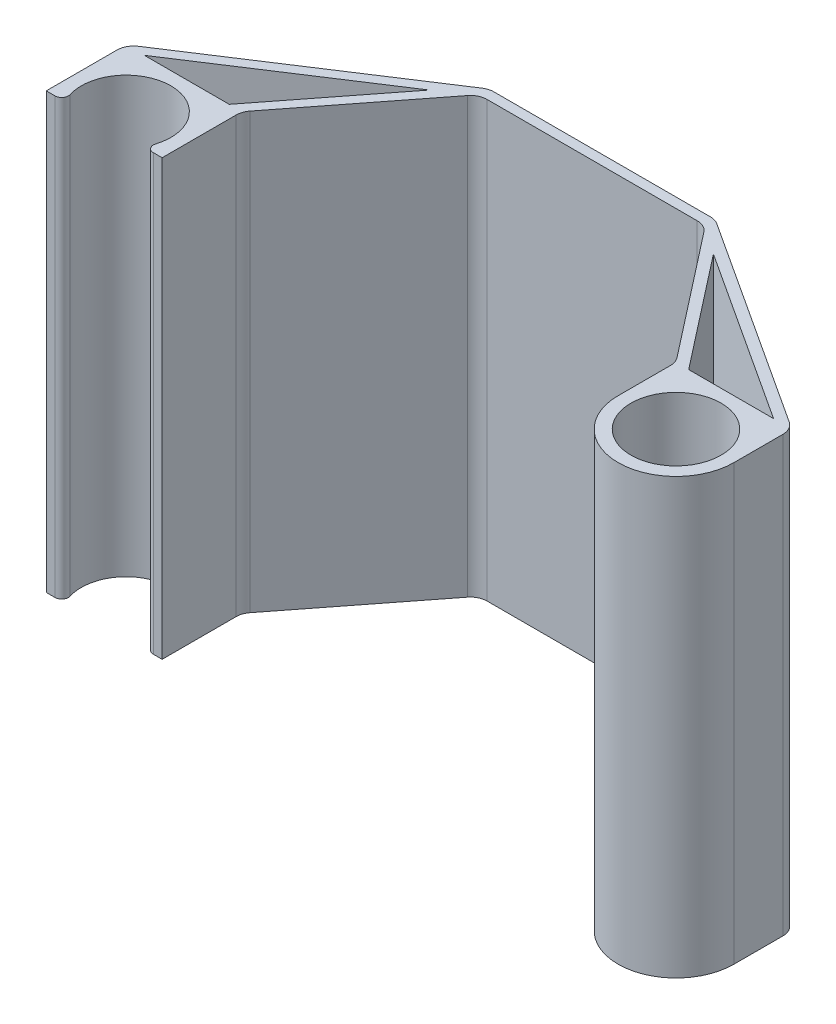
ISO-10303-21;
HEADER;
FILE_DESCRIPTION(('STEP AP214'),'2;1');
FILE_NAME('part.step','',(''),(''),'','','');
FILE_SCHEMA(('AUTOMOTIVE_DESIGN { 1 0 10303 214 1 1 1 1 }'));
ENDSEC;
DATA;
#1=APPLICATION_CONTEXT('core data for automotive mechanical design processes');
#2=APPLICATION_PROTOCOL_DEFINITION('international standard','automotive_design',2000,#1);
#3=PRODUCT_CONTEXT('',#1,'mechanical');
#4=PRODUCT('Part','Part','',(#3));
#5=PRODUCT_RELATED_PRODUCT_CATEGORY('part','',(#4));
#6=PRODUCT_DEFINITION_FORMATION('','',#4);
#7=PRODUCT_DEFINITION_CONTEXT('part definition',#1,'design');
#8=PRODUCT_DEFINITION('design','',#6,#7);
#9=PRODUCT_DEFINITION_SHAPE('','',#8);
#10=(LENGTH_UNIT() NAMED_UNIT(*) SI_UNIT(.MILLI.,.METRE.));
#11=(NAMED_UNIT(*) PLANE_ANGLE_UNIT() SI_UNIT($,.RADIAN.));
#12=(NAMED_UNIT(*) SI_UNIT($,.STERADIAN.) SOLID_ANGLE_UNIT());
#13=UNCERTAINTY_MEASURE_WITH_UNIT(LENGTH_MEASURE(1.E-05),#10,'distance_accuracy_value','');
#14=(GEOMETRIC_REPRESENTATION_CONTEXT(3) GLOBAL_UNCERTAINTY_ASSIGNED_CONTEXT((#13)) GLOBAL_UNIT_ASSIGNED_CONTEXT((#10,
#11,#12)) REPRESENTATION_CONTEXT('',''));
#15=CARTESIAN_POINT('',(0.,0.,0.));
#16=DIRECTION('',(0.,0.,1.));
#17=DIRECTION('',(1.,0.,0.));
#18=AXIS2_PLACEMENT_3D('',#15,#16,#17);
#19=CARTESIAN_POINT('',(65.2,130.5,66.97));
#20=DIRECTION('',(-1.,0.,0.));
#21=DIRECTION('',(0.,0.,1.));
#22=AXIS2_PLACEMENT_3D('',#19,#20,#21);
#23=PLANE('',#22);
#24=DIRECTION('',(0.,0.,-1.));
#25=VECTOR('',#24,1.);
#26=CARTESIAN_POINT('',(65.2,0.,66.97));
#27=LINE('',#26,#25);
#28=CARTESIAN_POINT('',(65.2,0.,60.4));
#29=VERTEX_POINT('',#28);
#30=CARTESIAN_POINT('',(65.2,0.,44.7194045448655));
#31=VERTEX_POINT('',#30);
#32=EDGE_CURVE('E266',#29,#31,#27,.T.);
#33=ORIENTED_EDGE('',*,*,#32,.F.);
#34=DIRECTION('',(0.,-1.,0.));
#35=VECTOR('',#34,1.);
#36=CARTESIAN_POINT('',(65.2,130.5,60.4));
#37=LINE('',#36,#35);
#38=CARTESIAN_POINT('',(65.2,130.5,60.4));
#39=VERTEX_POINT('',#38);
#40=EDGE_CURVE('E240',#39,#29,#37,.T.);
#41=ORIENTED_EDGE('',*,*,#40,.F.);
#42=DIRECTION('',(0.,0.,-1.));
#43=VECTOR('',#42,1.);
#44=CARTESIAN_POINT('',(65.2,130.5,66.97));
#45=LINE('',#44,#43);
#46=CARTESIAN_POINT('',(65.2,130.5,44.7194045448655));
#47=VERTEX_POINT('',#46);
#48=EDGE_CURVE('E249',#39,#47,#45,.T.);
#49=ORIENTED_EDGE('',*,*,#48,.T.);
#50=DIRECTION('',(0.,-1.,0.));
#51=VECTOR('',#50,1.);
#52=CARTESIAN_POINT('',(65.2,0.,44.7194045448655));
#53=LINE('',#52,#51);
#54=EDGE_CURVE('E402',#47,#31,#53,.T.);
#55=ORIENTED_EDGE('',*,*,#54,.T.);
#56=EDGE_LOOP('',(#33,#41,#49,#55));
#57=FACE_BOUND('',#56,.T.);
#58=ADVANCED_FACE('F36',(#57),#23,.T.);
#59=CARTESIAN_POINT('',(-97.3586449242469,130.5,64.97));
#60=DIRECTION('',(0.,-1.,0.));
#61=DIRECTION('',(0.,0.,-1.));
#62=AXIS2_PLACEMENT_3D('',#59,#60,#61);
#63=PLANE('',#62);
#64=CARTESIAN_POINT('',(82.6,130.5,60.4));
#65=DIRECTION('',(0.,-1.,0.));
#66=DIRECTION('',(0.,0.,-1.));
#67=AXIS2_PLACEMENT_3D('',#64,#65,#66);
#68=CIRCLE('',#67,13.55);
#69=CARTESIAN_POINT('',(82.6,130.5,46.85));
#70=VERTEX_POINT('',#69);
#71=EDGE_CURVE('E492',#70,#70,#68,.T.);
#72=ORIENTED_EDGE('',*,*,#71,.T.);
#73=EDGE_LOOP('',(#72));
#74=FACE_BOUND('',#73,.T.);
#75=DIRECTION('',(-1.,0.,0.));
#76=VECTOR('',#75,1.);
#77=CARTESIAN_POINT('',(69.004681326997,130.5,43.));
#78=LINE('',#77,#76);
#79=CARTESIAN_POINT('',(94.5042914623327,130.5,43.));
#80=VERTEX_POINT('',#79);
#81=CARTESIAN_POINT('',(69.004681326997,130.5,43.));
#82=VERTEX_POINT('',#81);
#83=EDGE_CURVE('E486',#80,#82,#78,.T.);
#84=ORIENTED_EDGE('',*,*,#83,.T.);
#85=DIRECTION('',(-0.615031798693877,0.,-0.788502306017791));
#86=VECTOR('',#85,1.);
#87=CARTESIAN_POINT('',(69.004681326997,130.5,43.));
#88=LINE('',#87,#86);
#89=CARTESIAN_POINT('',(42.6566553276392,130.5,9.22047948800275));
#90=VERTEX_POINT('',#89);
#91=EDGE_CURVE('E478',#82,#90,#88,.T.);
#92=ORIENTED_EDGE('',*,*,#91,.T.);
#93=DIRECTION('',(0.837863058280952,0.,0.545880477364863));
#94=VECTOR('',#93,1.);
#95=CARTESIAN_POINT('',(94.5042914623327,130.5,43.));
#96=LINE('',#95,#94);
#97=EDGE_CURVE('E474',#90,#80,#96,.T.);
#98=ORIENTED_EDGE('',*,*,#97,.T.);
#99=EDGE_LOOP('',(#84,#92,#98));
#100=FACE_BOUND('',#99,.T.);
#101=DIRECTION('',(0.615031798693877,0.,-0.788502306017791));
#102=VECTOR('',#101,1.);
#103=CARTESIAN_POINT('',(-69.004681326997,130.5,43.));
#104=LINE('',#103,#102);
#105=CARTESIAN_POINT('',(-69.004681326997,130.5,43.));
#106=VERTEX_POINT('',#105);
#107=CARTESIAN_POINT('',(-42.6566553276392,130.5,9.22047948800275));
#108=VERTEX_POINT('',#107);
#109=EDGE_CURVE('E274',#106,#108,#104,.T.);
#110=ORIENTED_EDGE('',*,*,#109,.F.);
#111=DIRECTION('',(1.,0.,0.));
#112=VECTOR('',#111,1.);
#113=CARTESIAN_POINT('',(-69.004681326997,130.5,43.));
#114=LINE('',#113,#112);
#115=CARTESIAN_POINT('',(-94.5042914623327,130.5,43.));
#116=VERTEX_POINT('',#115);
#117=EDGE_CURVE('E280',#116,#106,#114,.T.);
#118=ORIENTED_EDGE('',*,*,#117,.F.);
#119=DIRECTION('',(-0.837863058280952,0.,0.545880477364863));
#120=VECTOR('',#119,1.);
#121=CARTESIAN_POINT('',(-94.5042914623327,130.5,43.));
#122=LINE('',#121,#120);
#123=EDGE_CURVE('E276',#108,#116,#122,.T.);
#124=ORIENTED_EDGE('',*,*,#123,.F.);
#125=EDGE_LOOP('',(#110,#118,#124));
#126=FACE_BOUND('',#125,.T.);
#127=ORIENTED_EDGE('',*,*,#48,.F.);
#128=CARTESIAN_POINT('',(82.6,130.5,60.4));
#129=DIRECTION('',(0.,1.,0.));
#130=DIRECTION('',(0.,0.,-1.));
#131=AXIS2_PLACEMENT_3D('',#128,#129,#130);
#132=CIRCLE('',#131,17.4);
#133=CARTESIAN_POINT('',(100.,130.5,60.4));
#134=VERTEX_POINT('',#133);
#135=EDGE_CURVE('E234',#39,#134,#132,.T.);
#136=ORIENTED_EDGE('',*,*,#135,.T.);
#137=DIRECTION('',(0.,0.,1.));
#138=VECTOR('',#137,1.);
#139=CARTESIAN_POINT('',(100.,130.5,43.));
#140=LINE('',#139,#138);
#141=CARTESIAN_POINT('',(100.,130.5,45.7099865434267));
#142=VERTEX_POINT('',#141);
#143=EDGE_CURVE('E246',#142,#134,#140,.T.);
#144=ORIENTED_EDGE('',*,*,#143,.F.);
#145=CARTESIAN_POINT('',(95.,130.5,45.7099865434267));
#146=DIRECTION('',(0.,-1.,0.));
#147=DIRECTION('',(0.,0.,-1.));
#148=AXIS2_PLACEMENT_3D('',#145,#146,#147);
#149=CIRCLE('',#148,5.);
#150=CARTESIAN_POINT('',(97.7294023868243,130.5,41.5206712520219));
#151=VERTEX_POINT('',#150);
#152=EDGE_CURVE('E383',#142,#151,#149,.F.);
#153=ORIENTED_EDGE('',*,*,#152,.T.);
#154=DIRECTION('',(0.837863058280952,0.,0.545880477364863));
#155=VECTOR('',#154,1.);
#156=CARTESIAN_POINT('',(34.,130.5,0.));
#157=LINE('',#156,#155);
#158=CARTESIAN_POINT('',(35.2443067620299,130.5,0.810684708595236));
#159=VERTEX_POINT('',#158);
#160=EDGE_CURVE('E254',#159,#151,#157,.T.);
#161=ORIENTED_EDGE('',*,*,#160,.F.);
#162=CARTESIAN_POINT('',(32.5149043752056,130.5,5.));
#163=DIRECTION('',(0.,-1.,0.));
#164=DIRECTION('',(0.,0.,-1.));
#165=AXIS2_PLACEMENT_3D('',#162,#163,#164);
#166=CIRCLE('',#165,5.);
#167=CARTESIAN_POINT('',(32.5149043752056,130.5,0.));
#168=VERTEX_POINT('',#167);
#169=EDGE_CURVE('E385',#159,#168,#166,.F.);
#170=ORIENTED_EDGE('',*,*,#169,.T.);
#171=DIRECTION('',(-1.,0.,0.));
#172=VECTOR('',#171,1.);
#173=CARTESIAN_POINT('',(0.,130.5,0.));
#174=LINE('',#173,#172);
#175=CARTESIAN_POINT('',(-32.5149043752056,130.5,0.));
#176=VERTEX_POINT('',#175);
#177=EDGE_CURVE('E298',#168,#176,#174,.T.);
#178=ORIENTED_EDGE('',*,*,#177,.T.);
#179=CARTESIAN_POINT('',(-32.5149043752056,130.5,5.));
#180=DIRECTION('',(0.,-1.,0.));
#181=DIRECTION('',(0.,0.,-1.));
#182=AXIS2_PLACEMENT_3D('',#179,#180,#181);
#183=CIRCLE('',#182,5.);
#184=CARTESIAN_POINT('',(-35.2443067620299,130.5,0.810684708595245));
#185=VERTEX_POINT('',#184);
#186=EDGE_CURVE('E387',#176,#185,#183,.F.);
#187=ORIENTED_EDGE('',*,*,#186,.T.);
#188=DIRECTION('',(-0.837863058280952,0.,0.545880477364863));
#189=VECTOR('',#188,1.);
#190=CARTESIAN_POINT('',(-34.,130.5,0.));
#191=LINE('',#190,#189);
#192=CARTESIAN_POINT('',(-97.7294023868243,130.5,41.5206712520219));
#193=VERTEX_POINT('',#192);
#194=EDGE_CURVE('E301',#185,#193,#191,.T.);
#195=ORIENTED_EDGE('',*,*,#194,.T.);
#196=CARTESIAN_POINT('',(-95.,130.5,45.7099865434267));
#197=DIRECTION('',(0.,-1.,0.));
#198=DIRECTION('',(0.,0.,-1.));
#199=AXIS2_PLACEMENT_3D('',#196,#197,#198);
#200=CIRCLE('',#199,5.);
#201=CARTESIAN_POINT('',(-100.,130.5,45.7099865434267));
#202=VERTEX_POINT('',#201);
#203=EDGE_CURVE('E389',#193,#202,#200,.F.);
#204=ORIENTED_EDGE('',*,*,#203,.T.);
#205=DIRECTION('',(0.,0.,1.));
#206=VECTOR('',#205,1.);
#207=CARTESIAN_POINT('',(-100.,130.5,43.));
#208=LINE('',#207,#206);
#209=CARTESIAN_POINT('',(-100.,130.5,66.97));
#210=VERTEX_POINT('',#209);
#211=EDGE_CURVE('E305',#202,#210,#208,.T.);
#212=ORIENTED_EDGE('',*,*,#211,.T.);
#213=DIRECTION('',(1.,0.,0.));
#214=VECTOR('',#213,1.);
#215=CARTESIAN_POINT('',(-100.,130.5,66.97));
#216=LINE('',#215,#214);
#217=CARTESIAN_POINT('',(-97.3586449242469,130.5,66.97));
#218=VERTEX_POINT('',#217);
#219=EDGE_CURVE('E307',#210,#218,#216,.T.);
#220=ORIENTED_EDGE('',*,*,#219,.T.);
#221=CARTESIAN_POINT('',(-97.3586449242469,130.5,64.97));
#222=DIRECTION('',(0.,1.,0.));
#223=DIRECTION('',(0.,0.,-1.));
#224=AXIS2_PLACEMENT_3D('',#221,#222,#223);
#225=CIRCLE('',#224,1.99999999999999);
#226=CARTESIAN_POINT('',(-95.4481407269334,130.5,64.3784142394822));
#227=VERTEX_POINT('',#226);
#228=EDGE_CURVE('E309',#218,#227,#225,.T.);
#229=ORIENTED_EDGE('',*,*,#228,.T.);
#230=CARTESIAN_POINT('',(-82.6,130.5,60.4));
#231=DIRECTION('',(0.,-1.,0.));
#232=DIRECTION('',(0.,0.,-1.));
#233=AXIS2_PLACEMENT_3D('',#230,#231,#232);
#234=CIRCLE('',#233,13.45);
#235=CARTESIAN_POINT('',(-69.7518592730666,130.5,64.3784142394822));
#236=VERTEX_POINT('',#235);
#237=EDGE_CURVE('E311',#227,#236,#234,.T.);
#238=ORIENTED_EDGE('',*,*,#237,.T.);
#239=CARTESIAN_POINT('',(-67.8413550757531,130.5,64.97));
#240=DIRECTION('',(0.,1.,0.));
#241=DIRECTION('',(0.,0.,-1.));
#242=AXIS2_PLACEMENT_3D('',#239,#240,#241);
#243=CIRCLE('',#242,1.99999999999999);
#244=CARTESIAN_POINT('',(-67.8413550757531,130.5,66.97));
#245=VERTEX_POINT('',#244);
#246=EDGE_CURVE('E313',#236,#245,#243,.T.);
#247=ORIENTED_EDGE('',*,*,#246,.T.);
#248=DIRECTION('',(1.,0.,0.));
#249=VECTOR('',#248,1.);
#250=CARTESIAN_POINT('',(-67.8413550757531,130.5,66.97));
#251=LINE('',#250,#249);
#252=CARTESIAN_POINT('',(-65.2,130.5,66.97));
#253=VERTEX_POINT('',#252);
#254=EDGE_CURVE('E315',#245,#253,#251,.T.);
#255=ORIENTED_EDGE('',*,*,#254,.T.);
#256=DIRECTION('',(0.,0.,-1.));
#257=VECTOR('',#256,1.);
#258=CARTESIAN_POINT('',(-65.2,130.5,66.97));
#259=LINE('',#258,#257);
#260=CARTESIAN_POINT('',(-65.2,130.5,44.7194045448655));
#261=VERTEX_POINT('',#260);
#262=EDGE_CURVE('E317',#253,#261,#259,.T.);
#263=ORIENTED_EDGE('',*,*,#262,.T.);
#264=CARTESIAN_POINT('',(-60.2,130.5,44.7194045448655));
#265=DIRECTION('',(0.,-1.,0.));
#266=DIRECTION('',(0.,0.,-1.));
#267=AXIS2_PLACEMENT_3D('',#264,#265,#266);
#268=CIRCLE('',#267,5.);
#269=CARTESIAN_POINT('',(-64.142511530089,130.5,41.6442455513961));
#270=VERTEX_POINT('',#269);
#271=EDGE_CURVE('E11',#261,#270,#268,.T.);
#272=ORIENTED_EDGE('',*,*,#271,.T.);
#273=DIRECTION('',(0.615031798693877,0.,-0.788502306017791));
#274=VECTOR('',#273,1.);
#275=CARTESIAN_POINT('',(-34.,130.5,3.));
#276=LINE('',#275,#274);
#277=CARTESIAN_POINT('',(-35.5013759850939,130.5,4.92484100653062));
#278=VERTEX_POINT('',#277);
#279=EDGE_CURVE('E320',#270,#278,#276,.T.);
#280=ORIENTED_EDGE('',*,*,#279,.T.);
#281=CARTESIAN_POINT('',(-31.5588644550049,130.5,8.));
#282=DIRECTION('',(0.,-1.,0.));
#283=DIRECTION('',(0.,0.,-1.));
#284=AXIS2_PLACEMENT_3D('',#281,#282,#283);
#285=CIRCLE('',#284,5.);
#286=CARTESIAN_POINT('',(-31.5588644550049,130.5,3.));
#287=VERTEX_POINT('',#286);
#288=EDGE_CURVE('E431',#278,#287,#285,.T.);
#289=ORIENTED_EDGE('',*,*,#288,.T.);
#290=DIRECTION('',(1.,0.,0.));
#291=VECTOR('',#290,1.);
#292=CARTESIAN_POINT('',(-34.,130.5,3.));
#293=LINE('',#292,#291);
#294=CARTESIAN_POINT('',(31.5588644550049,130.5,3.));
#295=VERTEX_POINT('',#294);
#296=EDGE_CURVE('E323',#287,#295,#293,.T.);
#297=ORIENTED_EDGE('',*,*,#296,.T.);
#298=CARTESIAN_POINT('',(31.5588644550049,130.5,8.));
#299=DIRECTION('',(0.,-1.,0.));
#300=DIRECTION('',(0.,0.,-1.));
#301=AXIS2_PLACEMENT_3D('',#298,#299,#300);
#302=CIRCLE('',#301,5.);
#303=CARTESIAN_POINT('',(35.5013759850939,130.5,4.92484100653062));
#304=VERTEX_POINT('',#303);
#305=EDGE_CURVE('E427',#295,#304,#302,.T.);
#306=ORIENTED_EDGE('',*,*,#305,.T.);
#307=DIRECTION('',(-0.615031798693877,0.,-0.788502306017791));
#308=VECTOR('',#307,1.);
#309=CARTESIAN_POINT('',(34.,130.5,3.));
#310=LINE('',#309,#308);
#311=CARTESIAN_POINT('',(64.142511530089,130.5,41.6442455513961));
#312=VERTEX_POINT('',#311);
#313=EDGE_CURVE('E259',#312,#304,#310,.T.);
#314=ORIENTED_EDGE('',*,*,#313,.F.);
#315=CARTESIAN_POINT('',(60.2,130.5,44.7194045448655));
#316=DIRECTION('',(0.,-1.,0.));
#317=DIRECTION('',(0.,0.,-1.));
#318=AXIS2_PLACEMENT_3D('',#315,#316,#317);
#319=CIRCLE('',#318,5.);
#320=EDGE_CURVE('E423',#312,#47,#319,.T.);
#321=ORIENTED_EDGE('',*,*,#320,.T.);
#322=EDGE_LOOP('',(#127,#136,#144,#153,#161,#170,#178,#187,#195,#204,#212,#220,#229,#238,#247,
#255,#263,#272,#280,#289,#297,#306,#314,#321));
#323=FACE_BOUND('',#322,.T.);
#324=ADVANCED_FACE('F245',(#74,#100,#126,#323),#63,.F.);
#325=CARTESIAN_POINT('',(-97.3586449242469,0.,64.97));
#326=DIRECTION('',(0.,-1.,0.));
#327=DIRECTION('',(0.,0.,-1.));
#328=AXIS2_PLACEMENT_3D('',#325,#326,#327);
#329=PLANE('',#328);
#330=CARTESIAN_POINT('',(82.6,0.,60.4));
#331=DIRECTION('',(0.,-1.,0.));
#332=DIRECTION('',(0.,0.,-1.));
#333=AXIS2_PLACEMENT_3D('',#330,#331,#332);
#334=CIRCLE('',#333,13.55);
#335=CARTESIAN_POINT('',(82.6,0.,46.85));
#336=VERTEX_POINT('',#335);
#337=EDGE_CURVE('E494',#336,#336,#334,.T.);
#338=ORIENTED_EDGE('',*,*,#337,.F.);
#339=EDGE_LOOP('',(#338));
#340=FACE_BOUND('',#339,.T.);
#341=CARTESIAN_POINT('',(82.6,0.,60.4));
#342=DIRECTION('',(0.,1.,0.));
#343=DIRECTION('',(0.,0.,-1.));
#344=AXIS2_PLACEMENT_3D('',#341,#342,#343);
#345=CIRCLE('',#344,17.4);
#346=CARTESIAN_POINT('',(100.,0.,60.4));
#347=VERTEX_POINT('',#346);
#348=EDGE_CURVE('E51',#29,#347,#345,.T.);
#349=ORIENTED_EDGE('',*,*,#348,.F.);
#350=ORIENTED_EDGE('',*,*,#32,.T.);
#351=CARTESIAN_POINT('',(60.2,0.,44.7194045448655));
#352=DIRECTION('',(0.,-1.,0.));
#353=DIRECTION('',(0.,0.,-1.));
#354=AXIS2_PLACEMENT_3D('',#351,#352,#353);
#355=CIRCLE('',#354,5.);
#356=CARTESIAN_POINT('',(64.142511530089,0.,41.6442455513961));
#357=VERTEX_POINT('',#356);
#358=EDGE_CURVE('E421',#31,#357,#355,.F.);
#359=ORIENTED_EDGE('',*,*,#358,.T.);
#360=DIRECTION('',(-0.615031798693877,0.,-0.788502306017791));
#361=VECTOR('',#360,1.);
#362=CARTESIAN_POINT('',(34.,0.,3.));
#363=LINE('',#362,#361);
#364=CARTESIAN_POINT('',(35.5013759850939,0.,4.92484100653062));
#365=VERTEX_POINT('',#364);
#366=EDGE_CURVE('E263',#357,#365,#363,.T.);
#367=ORIENTED_EDGE('',*,*,#366,.T.);
#368=CARTESIAN_POINT('',(31.5588644550049,0.,8.));
#369=DIRECTION('',(0.,-1.,0.));
#370=DIRECTION('',(0.,0.,-1.));
#371=AXIS2_PLACEMENT_3D('',#368,#369,#370);
#372=CIRCLE('',#371,5.);
#373=CARTESIAN_POINT('',(31.5588644550049,0.,3.));
#374=VERTEX_POINT('',#373);
#375=EDGE_CURVE('E425',#365,#374,#372,.F.);
#376=ORIENTED_EDGE('',*,*,#375,.T.);
#377=DIRECTION('',(1.,0.,0.));
#378=VECTOR('',#377,1.);
#379=CARTESIAN_POINT('',(-34.,0.,3.));
#380=LINE('',#379,#378);
#381=CARTESIAN_POINT('',(-31.5588644550049,0.,3.));
#382=VERTEX_POINT('',#381);
#383=EDGE_CURVE('E302',#382,#374,#380,.T.);
#384=ORIENTED_EDGE('',*,*,#383,.F.);
#385=CARTESIAN_POINT('',(-31.5588644550049,0.,8.));
#386=DIRECTION('',(0.,-1.,0.));
#387=DIRECTION('',(0.,0.,-1.));
#388=AXIS2_PLACEMENT_3D('',#385,#386,#387);
#389=CIRCLE('',#388,5.);
#390=CARTESIAN_POINT('',(-35.5013759850939,0.,4.92484100653062));
#391=VERTEX_POINT('',#390);
#392=EDGE_CURVE('E429',#382,#391,#389,.F.);
#393=ORIENTED_EDGE('',*,*,#392,.T.);
#394=DIRECTION('',(0.615031798693877,0.,-0.788502306017791));
#395=VECTOR('',#394,1.);
#396=CARTESIAN_POINT('',(-34.,0.,3.));
#397=LINE('',#396,#395);
#398=CARTESIAN_POINT('',(-64.142511530089,0.,41.6442455513961));
#399=VERTEX_POINT('',#398);
#400=EDGE_CURVE('E346',#399,#391,#397,.T.);
#401=ORIENTED_EDGE('',*,*,#400,.F.);
#402=CARTESIAN_POINT('',(-60.2,0.,44.7194045448655));
#403=DIRECTION('',(0.,-1.,0.));
#404=DIRECTION('',(0.,0.,-1.));
#405=AXIS2_PLACEMENT_3D('',#402,#403,#404);
#406=CIRCLE('',#405,5.);
#407=CARTESIAN_POINT('',(-65.2,0.,44.7194045448655));
#408=VERTEX_POINT('',#407);
#409=EDGE_CURVE('E44',#399,#408,#406,.F.);
#410=ORIENTED_EDGE('',*,*,#409,.T.);
#411=DIRECTION('',(0.,0.,-1.));
#412=VECTOR('',#411,1.);
#413=CARTESIAN_POINT('',(-65.2,0.,66.97));
#414=LINE('',#413,#412);
#415=CARTESIAN_POINT('',(-65.2,0.,66.97));
#416=VERTEX_POINT('',#415);
#417=EDGE_CURVE('E343',#416,#408,#414,.T.);
#418=ORIENTED_EDGE('',*,*,#417,.F.);
#419=DIRECTION('',(1.,0.,0.));
#420=VECTOR('',#419,1.);
#421=CARTESIAN_POINT('',(-67.8413550757531,0.,66.97));
#422=LINE('',#421,#420);
#423=CARTESIAN_POINT('',(-67.8413550757531,0.,66.97));
#424=VERTEX_POINT('',#423);
#425=EDGE_CURVE('E341',#424,#416,#422,.T.);
#426=ORIENTED_EDGE('',*,*,#425,.F.);
#427=CARTESIAN_POINT('',(-67.8413550757531,0.,64.97));
#428=DIRECTION('',(0.,1.,0.));
#429=DIRECTION('',(0.,0.,-1.));
#430=AXIS2_PLACEMENT_3D('',#427,#428,#429);
#431=CIRCLE('',#430,1.99999999999999);
#432=CARTESIAN_POINT('',(-69.7518592730666,0.,64.3784142394822));
#433=VERTEX_POINT('',#432);
#434=EDGE_CURVE('E339',#433,#424,#431,.T.);
#435=ORIENTED_EDGE('',*,*,#434,.F.);
#436=CARTESIAN_POINT('',(-82.6,0.,60.4));
#437=DIRECTION('',(0.,-1.,0.));
#438=DIRECTION('',(0.,0.,-1.));
#439=AXIS2_PLACEMENT_3D('',#436,#437,#438);
#440=CIRCLE('',#439,13.45);
#441=CARTESIAN_POINT('',(-95.4481407269334,0.,64.3784142394822));
#442=VERTEX_POINT('',#441);
#443=EDGE_CURVE('E337',#442,#433,#440,.T.);
#444=ORIENTED_EDGE('',*,*,#443,.F.);
#445=CARTESIAN_POINT('',(-97.3586449242469,0.,64.97));
#446=DIRECTION('',(0.,1.,0.));
#447=DIRECTION('',(0.,0.,-1.));
#448=AXIS2_PLACEMENT_3D('',#445,#446,#447);
#449=CIRCLE('',#448,1.99999999999999);
#450=CARTESIAN_POINT('',(-97.3586449242469,0.,66.97));
#451=VERTEX_POINT('',#450);
#452=EDGE_CURVE('E335',#451,#442,#449,.T.);
#453=ORIENTED_EDGE('',*,*,#452,.F.);
#454=DIRECTION('',(1.,0.,0.));
#455=VECTOR('',#454,1.);
#456=CARTESIAN_POINT('',(-100.,0.,66.97));
#457=LINE('',#456,#455);
#458=CARTESIAN_POINT('',(-100.,0.,66.97));
#459=VERTEX_POINT('',#458);
#460=EDGE_CURVE('E333',#459,#451,#457,.T.);
#461=ORIENTED_EDGE('',*,*,#460,.F.);
#462=DIRECTION('',(0.,0.,1.));
#463=VECTOR('',#462,1.);
#464=CARTESIAN_POINT('',(-100.,0.,43.));
#465=LINE('',#464,#463);
#466=CARTESIAN_POINT('',(-100.,0.,45.7099865434267));
#467=VERTEX_POINT('',#466);
#468=EDGE_CURVE('E331',#467,#459,#465,.T.);
#469=ORIENTED_EDGE('',*,*,#468,.F.);
#470=CARTESIAN_POINT('',(-95.,0.,45.7099865434267));
#471=DIRECTION('',(0.,-1.,0.));
#472=DIRECTION('',(0.,0.,-1.));
#473=AXIS2_PLACEMENT_3D('',#470,#471,#472);
#474=CIRCLE('',#473,5.);
#475=CARTESIAN_POINT('',(-97.7294023868243,0.,41.5206712520219));
#476=VERTEX_POINT('',#475);
#477=EDGE_CURVE('E376',#467,#476,#474,.T.);
#478=ORIENTED_EDGE('',*,*,#477,.T.);
#479=DIRECTION('',(-0.837863058280952,0.,0.545880477364863));
#480=VECTOR('',#479,1.);
#481=CARTESIAN_POINT('',(-34.,0.,0.));
#482=LINE('',#481,#480);
#483=CARTESIAN_POINT('',(-35.2443067620299,0.,0.810684708595245));
#484=VERTEX_POINT('',#483);
#485=EDGE_CURVE('E328',#484,#476,#482,.T.);
#486=ORIENTED_EDGE('',*,*,#485,.F.);
#487=CARTESIAN_POINT('',(-32.5149043752056,0.,5.));
#488=DIRECTION('',(0.,-1.,0.));
#489=DIRECTION('',(0.,0.,-1.));
#490=AXIS2_PLACEMENT_3D('',#487,#488,#489);
#491=CIRCLE('',#490,5.);
#492=CARTESIAN_POINT('',(-32.5149043752056,0.,0.));
#493=VERTEX_POINT('',#492);
#494=EDGE_CURVE('E374',#484,#493,#491,.T.);
#495=ORIENTED_EDGE('',*,*,#494,.T.);
#496=DIRECTION('',(-1.,0.,0.));
#497=VECTOR('',#496,1.);
#498=CARTESIAN_POINT('',(0.,0.,0.));
#499=LINE('',#498,#497);
#500=CARTESIAN_POINT('',(32.5149043752056,0.,0.));
#501=VERTEX_POINT('',#500);
#502=EDGE_CURVE('E297',#501,#493,#499,.T.);
#503=ORIENTED_EDGE('',*,*,#502,.F.);
#504=CARTESIAN_POINT('',(32.5149043752056,0.,5.));
#505=DIRECTION('',(0.,-1.,0.));
#506=DIRECTION('',(0.,0.,-1.));
#507=AXIS2_PLACEMENT_3D('',#504,#505,#506);
#508=CIRCLE('',#507,5.);
#509=CARTESIAN_POINT('',(35.2443067620299,0.,0.810684708595236));
#510=VERTEX_POINT('',#509);
#511=EDGE_CURVE('E372',#501,#510,#508,.T.);
#512=ORIENTED_EDGE('',*,*,#511,.T.);
#513=DIRECTION('',(0.837863058280952,0.,0.545880477364863));
#514=VECTOR('',#513,1.);
#515=CARTESIAN_POINT('',(34.,0.,0.));
#516=LINE('',#515,#514);
#517=CARTESIAN_POINT('',(97.7294023868243,0.,41.5206712520219));
#518=VERTEX_POINT('',#517);
#519=EDGE_CURVE('E271',#510,#518,#516,.T.);
#520=ORIENTED_EDGE('',*,*,#519,.T.);
#521=CARTESIAN_POINT('',(95.,0.,45.7099865434267));
#522=DIRECTION('',(0.,-1.,0.));
#523=DIRECTION('',(0.,0.,-1.));
#524=AXIS2_PLACEMENT_3D('',#521,#522,#523);
#525=CIRCLE('',#524,5.);
#526=CARTESIAN_POINT('',(100.,0.,45.7099865434267));
#527=VERTEX_POINT('',#526);
#528=EDGE_CURVE('E370',#518,#527,#525,.T.);
#529=ORIENTED_EDGE('',*,*,#528,.T.);
#530=DIRECTION('',(0.,0.,1.));
#531=VECTOR('',#530,1.);
#532=CARTESIAN_POINT('',(100.,0.,43.));
#533=LINE('',#532,#531);
#534=EDGE_CURVE('E269',#527,#347,#533,.T.);
#535=ORIENTED_EDGE('',*,*,#534,.T.);
#536=EDGE_LOOP('',(#349,#350,#359,#367,#376,#384,#393,#401,#410,#418,#426,#435,#444,#453,#461,
#469,#478,#486,#495,#503,#512,#520,#529,#535));
#537=FACE_BOUND('',#536,.T.);
#538=DIRECTION('',(-0.615031798693877,0.,-0.788502306017791));
#539=VECTOR('',#538,1.);
#540=CARTESIAN_POINT('',(69.004681326997,0.,43.));
#541=LINE('',#540,#539);
#542=CARTESIAN_POINT('',(69.004681326997,0.,43.));
#543=VERTEX_POINT('',#542);
#544=CARTESIAN_POINT('',(42.6566553276392,0.,9.22047948800275));
#545=VERTEX_POINT('',#544);
#546=EDGE_CURVE('E482',#543,#545,#541,.T.);
#547=ORIENTED_EDGE('',*,*,#546,.F.);
#548=DIRECTION('',(-1.,0.,0.));
#549=VECTOR('',#548,1.);
#550=CARTESIAN_POINT('',(69.004681326997,0.,43.));
#551=LINE('',#550,#549);
#552=CARTESIAN_POINT('',(94.5042914623327,0.,43.));
#553=VERTEX_POINT('',#552);
#554=EDGE_CURVE('E479',#553,#543,#551,.T.);
#555=ORIENTED_EDGE('',*,*,#554,.F.);
#556=DIRECTION('',(0.837863058280952,0.,0.545880477364863));
#557=VECTOR('',#556,1.);
#558=CARTESIAN_POINT('',(94.5042914623327,0.,43.));
#559=LINE('',#558,#557);
#560=EDGE_CURVE('E475',#545,#553,#559,.T.);
#561=ORIENTED_EDGE('',*,*,#560,.F.);
#562=EDGE_LOOP('',(#547,#555,#561));
#563=FACE_BOUND('',#562,.T.);
#564=DIRECTION('',(1.,0.,0.));
#565=VECTOR('',#564,1.);
#566=CARTESIAN_POINT('',(-69.004681326997,0.,43.));
#567=LINE('',#566,#565);
#568=CARTESIAN_POINT('',(-94.5042914623327,0.,43.));
#569=VERTEX_POINT('',#568);
#570=CARTESIAN_POINT('',(-69.004681326997,0.,43.));
#571=VERTEX_POINT('',#570);
#572=EDGE_CURVE('E277',#569,#571,#567,.T.);
#573=ORIENTED_EDGE('',*,*,#572,.T.);
#574=DIRECTION('',(0.615031798693877,0.,-0.788502306017791));
#575=VECTOR('',#574,1.);
#576=CARTESIAN_POINT('',(-69.004681326997,0.,43.));
#577=LINE('',#576,#575);
#578=CARTESIAN_POINT('',(-42.6566553276392,0.,9.22047948800275));
#579=VERTEX_POINT('',#578);
#580=EDGE_CURVE('E257',#571,#579,#577,.T.);
#581=ORIENTED_EDGE('',*,*,#580,.T.);
#582=DIRECTION('',(-0.837863058280952,0.,0.545880477364863));
#583=VECTOR('',#582,1.);
#584=CARTESIAN_POINT('',(-94.5042914623327,0.,43.));
#585=LINE('',#584,#583);
#586=EDGE_CURVE('E285',#579,#569,#585,.T.);
#587=ORIENTED_EDGE('',*,*,#586,.T.);
#588=EDGE_LOOP('',(#573,#581,#587));
#589=FACE_BOUND('',#588,.T.);
#590=ADVANCED_FACE('F435',(#340,#537,#563,#589),#329,.T.);
#591=CARTESIAN_POINT('',(0.,130.5,0.));
#592=DIRECTION('',(0.,0.,1.));
#593=DIRECTION('',(1.,0.,0.));
#594=AXIS2_PLACEMENT_3D('',#591,#592,#593);
#595=PLANE('',#594);
#596=ORIENTED_EDGE('',*,*,#502,.T.);
#597=DIRECTION('',(0.,-1.,0.));
#598=VECTOR('',#597,1.);
#599=CARTESIAN_POINT('',(-32.5149043752056,130.5,0.));
#600=LINE('',#599,#598);
#601=EDGE_CURVE('E394',#493,#176,#600,.F.);
#602=ORIENTED_EDGE('',*,*,#601,.T.);
#603=ORIENTED_EDGE('',*,*,#177,.F.);
#604=DIRECTION('',(0.,-1.,0.));
#605=VECTOR('',#604,1.);
#606=CARTESIAN_POINT('',(32.5149043752056,0.,0.));
#607=LINE('',#606,#605);
#608=EDGE_CURVE('E391',#168,#501,#607,.T.);
#609=ORIENTED_EDGE('',*,*,#608,.T.);
#610=EDGE_LOOP('',(#596,#602,#603,#609));
#611=FACE_BOUND('',#610,.T.);
#612=ADVANCED_FACE('F509',(#611),#595,.F.);
#613=CARTESIAN_POINT('',(-34.,130.5,0.));
#614=DIRECTION('',(0.545880477364863,0.,0.837863058280952));
#615=DIRECTION('',(0.837863058280952,0.,-0.545880477364863));
#616=AXIS2_PLACEMENT_3D('',#613,#614,#615);
#617=PLANE('',#616);
#618=ORIENTED_EDGE('',*,*,#485,.T.);
#619=DIRECTION('',(0.,-1.,0.));
#620=VECTOR('',#619,1.);
#621=CARTESIAN_POINT('',(-97.7294023868243,130.5,41.5206712520219));
#622=LINE('',#621,#620);
#623=EDGE_CURVE('E381',#476,#193,#622,.F.);
#624=ORIENTED_EDGE('',*,*,#623,.T.);
#625=ORIENTED_EDGE('',*,*,#194,.F.);
#626=DIRECTION('',(0.,-1.,0.));
#627=VECTOR('',#626,1.);
#628=CARTESIAN_POINT('',(-35.2443067620299,130.5,0.810684708595245));
#629=LINE('',#628,#627);
#630=EDGE_CURVE('E378',#185,#484,#629,.T.);
#631=ORIENTED_EDGE('',*,*,#630,.T.);
#632=EDGE_LOOP('',(#618,#624,#625,#631));
#633=FACE_BOUND('',#632,.T.);
#634=ADVANCED_FACE('F516',(#633),#617,.F.);
#635=CARTESIAN_POINT('',(-100.,130.5,43.));
#636=DIRECTION('',(1.,0.,0.));
#637=DIRECTION('',(0.,0.,-1.));
#638=AXIS2_PLACEMENT_3D('',#635,#636,#637);
#639=PLANE('',#638);
#640=ORIENTED_EDGE('',*,*,#211,.F.);
#641=DIRECTION('',(0.,-1.,0.));
#642=VECTOR('',#641,1.);
#643=CARTESIAN_POINT('',(-100.,130.5,45.7099865434267));
#644=LINE('',#643,#642);
#645=EDGE_CURVE('E367',#202,#467,#644,.T.);
#646=ORIENTED_EDGE('',*,*,#645,.T.);
#647=ORIENTED_EDGE('',*,*,#468,.T.);
#648=DIRECTION('',(0.,-1.,0.));
#649=VECTOR('',#648,1.);
#650=CARTESIAN_POINT('',(-100.,130.5,66.97));
#651=LINE('',#650,#649);
#652=EDGE_CURVE('E364',#210,#459,#651,.T.);
#653=ORIENTED_EDGE('',*,*,#652,.F.);
#654=EDGE_LOOP('',(#640,#646,#647,#653));
#655=FACE_BOUND('',#654,.T.);
#656=ADVANCED_FACE('F581',(#655),#639,.F.);
#657=CARTESIAN_POINT('',(-100.,130.5,66.97));
#658=DIRECTION('',(0.,0.,-1.));
#659=DIRECTION('',(-1.,0.,0.));
#660=AXIS2_PLACEMENT_3D('',#657,#658,#659);
#661=PLANE('',#660);
#662=ORIENTED_EDGE('',*,*,#460,.T.);
#663=DIRECTION('',(0.,-1.,0.));
#664=VECTOR('',#663,1.);
#665=CARTESIAN_POINT('',(-97.3586449242469,130.5,66.97));
#666=LINE('',#665,#664);
#667=EDGE_CURVE('E361',#218,#451,#666,.T.);
#668=ORIENTED_EDGE('',*,*,#667,.F.);
#669=ORIENTED_EDGE('',*,*,#219,.F.);
#670=ORIENTED_EDGE('',*,*,#652,.T.);
#671=EDGE_LOOP('',(#662,#668,#669,#670));
#672=FACE_BOUND('',#671,.T.);
#673=ADVANCED_FACE('F577',(#672),#661,.F.);
#674=CARTESIAN_POINT('',(-97.3586449242469,130.5,64.97));
#675=DIRECTION('',(0.,-1.,0.));
#676=DIRECTION('',(0.,0.,-1.));
#677=AXIS2_PLACEMENT_3D('',#674,#675,#676);
#678=CYLINDRICAL_SURFACE('',#677,1.99999999999999);
#679=ORIENTED_EDGE('',*,*,#452,.T.);
#680=DIRECTION('',(0.,-1.,0.));
#681=VECTOR('',#680,1.);
#682=CARTESIAN_POINT('',(-95.4481407269334,130.5,64.3784142394822));
#683=LINE('',#682,#681);
#684=EDGE_CURVE('E358',#227,#442,#683,.T.);
#685=ORIENTED_EDGE('',*,*,#684,.F.);
#686=ORIENTED_EDGE('',*,*,#228,.F.);
#687=ORIENTED_EDGE('',*,*,#667,.T.);
#688=EDGE_LOOP('',(#679,#685,#686,#687));
#689=FACE_BOUND('',#688,.T.);
#690=ADVANCED_FACE('F573',(#689),#678,.T.);
#691=CARTESIAN_POINT('',(-82.6,130.5,60.4));
#692=DIRECTION('',(0.,-1.,0.));
#693=DIRECTION('',(0.,0.,-1.));
#694=AXIS2_PLACEMENT_3D('',#691,#692,#693);
#695=CYLINDRICAL_SURFACE('',#694,13.45);
#696=ORIENTED_EDGE('',*,*,#443,.T.);
#697=DIRECTION('',(0.,-1.,0.));
#698=VECTOR('',#697,1.);
#699=CARTESIAN_POINT('',(-69.7518592730666,130.5,64.3784142394822));
#700=LINE('',#699,#698);
#701=EDGE_CURVE('E355',#236,#433,#700,.T.);
#702=ORIENTED_EDGE('',*,*,#701,.F.);
#703=ORIENTED_EDGE('',*,*,#237,.F.);
#704=ORIENTED_EDGE('',*,*,#684,.T.);
#705=EDGE_LOOP('',(#696,#702,#703,#704));
#706=FACE_BOUND('',#705,.T.);
#707=ADVANCED_FACE('F569',(#706),#695,.F.);
#708=CARTESIAN_POINT('',(-67.8413550757531,130.5,64.97));
#709=DIRECTION('',(0.,-1.,0.));
#710=DIRECTION('',(0.,0.,-1.));
#711=AXIS2_PLACEMENT_3D('',#708,#709,#710);
#712=CYLINDRICAL_SURFACE('',#711,1.99999999999999);
#713=ORIENTED_EDGE('',*,*,#434,.T.);
#714=DIRECTION('',(0.,-1.,0.));
#715=VECTOR('',#714,1.);
#716=CARTESIAN_POINT('',(-67.8413550757531,130.5,66.97));
#717=LINE('',#716,#715);
#718=EDGE_CURVE('E352',#245,#424,#717,.T.);
#719=ORIENTED_EDGE('',*,*,#718,.F.);
#720=ORIENTED_EDGE('',*,*,#246,.F.);
#721=ORIENTED_EDGE('',*,*,#701,.T.);
#722=EDGE_LOOP('',(#713,#719,#720,#721));
#723=FACE_BOUND('',#722,.T.);
#724=ADVANCED_FACE('F565',(#723),#712,.T.);
#725=CARTESIAN_POINT('',(-67.8413550757531,130.5,66.97));
#726=DIRECTION('',(0.,0.,-1.));
#727=DIRECTION('',(-1.,0.,0.));
#728=AXIS2_PLACEMENT_3D('',#725,#726,#727);
#729=PLANE('',#728);
#730=ORIENTED_EDGE('',*,*,#425,.T.);
#731=DIRECTION('',(0.,-1.,0.));
#732=VECTOR('',#731,1.);
#733=CARTESIAN_POINT('',(-65.2,130.5,66.97));
#734=LINE('',#733,#732);
#735=EDGE_CURVE('E325',#253,#416,#734,.T.);
#736=ORIENTED_EDGE('',*,*,#735,.F.);
#737=ORIENTED_EDGE('',*,*,#254,.F.);
#738=ORIENTED_EDGE('',*,*,#718,.T.);
#739=EDGE_LOOP('',(#730,#736,#737,#738));
#740=FACE_BOUND('',#739,.T.);
#741=ADVANCED_FACE('F562',(#740),#729,.F.);
#742=CARTESIAN_POINT('',(-65.2,130.5,66.97));
#743=DIRECTION('',(-1.,0.,0.));
#744=DIRECTION('',(0.,0.,1.));
#745=AXIS2_PLACEMENT_3D('',#742,#743,#744);
#746=PLANE('',#745);
#747=ORIENTED_EDGE('',*,*,#417,.T.);
#748=DIRECTION('',(0.,-1.,0.));
#749=VECTOR('',#748,1.);
#750=CARTESIAN_POINT('',(-65.2,130.5,44.7194045448655));
#751=LINE('',#750,#749);
#752=EDGE_CURVE('E419',#408,#261,#751,.F.);
#753=ORIENTED_EDGE('',*,*,#752,.T.);
#754=ORIENTED_EDGE('',*,*,#262,.F.);
#755=ORIENTED_EDGE('',*,*,#735,.T.);
#756=EDGE_LOOP('',(#747,#753,#754,#755));
#757=FACE_BOUND('',#756,.T.);
#758=ADVANCED_FACE('F442',(#757),#746,.F.);
#759=CARTESIAN_POINT('',(-34.,130.5,3.));
#760=DIRECTION('',(-0.788502306017791,0.,-0.615031798693877));
#761=DIRECTION('',(-0.615031798693877,0.,0.788502306017791));
#762=AXIS2_PLACEMENT_3D('',#759,#760,#761);
#763=PLANE('',#762);
#764=ORIENTED_EDGE('',*,*,#400,.T.);
#765=DIRECTION('',(0.,-1.,0.));
#766=VECTOR('',#765,1.);
#767=CARTESIAN_POINT('',(-35.5013759850939,130.5,4.92484100653062));
#768=LINE('',#767,#766);
#769=EDGE_CURVE('E417',#391,#278,#768,.F.);
#770=ORIENTED_EDGE('',*,*,#769,.T.);
#771=ORIENTED_EDGE('',*,*,#279,.F.);
#772=DIRECTION('',(0.,-1.,0.));
#773=VECTOR('',#772,1.);
#774=CARTESIAN_POINT('',(-64.142511530089,0.,41.6442455513961));
#775=LINE('',#774,#773);
#776=EDGE_CURVE('E414',#270,#399,#775,.T.);
#777=ORIENTED_EDGE('',*,*,#776,.T.);
#778=EDGE_LOOP('',(#764,#770,#771,#777));
#779=FACE_BOUND('',#778,.T.);
#780=ADVANCED_FACE('F449',(#779),#763,.F.);
#781=CARTESIAN_POINT('',(-34.,130.5,3.));
#782=DIRECTION('',(0.,0.,-1.));
#783=DIRECTION('',(-1.,0.,0.));
#784=AXIS2_PLACEMENT_3D('',#781,#782,#783);
#785=PLANE('',#784);
#786=ORIENTED_EDGE('',*,*,#383,.T.);
#787=DIRECTION('',(0.,-1.,0.));
#788=VECTOR('',#787,1.);
#789=CARTESIAN_POINT('',(31.5588644550049,130.5,3.));
#790=LINE('',#789,#788);
#791=EDGE_CURVE('E59',#374,#295,#790,.F.);
#792=ORIENTED_EDGE('',*,*,#791,.T.);
#793=ORIENTED_EDGE('',*,*,#296,.F.);
#794=DIRECTION('',(0.,-1.,0.));
#795=VECTOR('',#794,1.);
#796=CARTESIAN_POINT('',(-31.5588644550049,0.,3.));
#797=LINE('',#796,#795);
#798=EDGE_CURVE('E410',#287,#382,#797,.T.);
#799=ORIENTED_EDGE('',*,*,#798,.T.);
#800=EDGE_LOOP('',(#786,#792,#793,#799));
#801=FACE_BOUND('',#800,.T.);
#802=ADVANCED_FACE('F455',(#801),#785,.F.);
#803=CARTESIAN_POINT('',(-69.004681326997,130.5,43.));
#804=DIRECTION('',(-0.788502306017791,0.,-0.615031798693877));
#805=DIRECTION('',(-0.615031798693877,0.,0.788502306017791));
#806=AXIS2_PLACEMENT_3D('',#803,#804,#805);
#807=PLANE('',#806);
#808=ORIENTED_EDGE('',*,*,#580,.F.);
#809=DIRECTION('',(0.,-1.,0.));
#810=VECTOR('',#809,1.);
#811=CARTESIAN_POINT('',(-69.004681326997,130.5,43.));
#812=LINE('',#811,#810);
#813=EDGE_CURVE('E282',#106,#571,#812,.T.);
#814=ORIENTED_EDGE('',*,*,#813,.F.);
#815=ORIENTED_EDGE('',*,*,#109,.T.);
#816=DIRECTION('',(0.,-1.,0.));
#817=VECTOR('',#816,1.);
#818=CARTESIAN_POINT('',(-42.6566553276392,130.5,9.22047948800275));
#819=LINE('',#818,#817);
#820=EDGE_CURVE('E294',#108,#579,#819,.T.);
#821=ORIENTED_EDGE('',*,*,#820,.T.);
#822=EDGE_LOOP('',(#808,#814,#815,#821));
#823=FACE_BOUND('',#822,.T.);
#824=ADVANCED_FACE('F540',(#823),#807,.T.);
#825=CARTESIAN_POINT('',(-94.5042914623327,130.5,43.));
#826=DIRECTION('',(0.545880477364863,0.,0.837863058280952));
#827=DIRECTION('',(0.837863058280952,0.,-0.545880477364863));
#828=AXIS2_PLACEMENT_3D('',#825,#826,#827);
#829=PLANE('',#828);
#830=ORIENTED_EDGE('',*,*,#586,.F.);
#831=ORIENTED_EDGE('',*,*,#820,.F.);
#832=ORIENTED_EDGE('',*,*,#123,.T.);
#833=DIRECTION('',(0.,-1.,0.));
#834=VECTOR('',#833,1.);
#835=CARTESIAN_POINT('',(-94.5042914623327,130.5,43.));
#836=LINE('',#835,#834);
#837=EDGE_CURVE('E292',#116,#569,#836,.T.);
#838=ORIENTED_EDGE('',*,*,#837,.T.);
#839=EDGE_LOOP('',(#830,#831,#832,#838));
#840=FACE_BOUND('',#839,.T.);
#841=ADVANCED_FACE('F536',(#840),#829,.T.);
#842=CARTESIAN_POINT('',(-69.004681326997,130.5,43.));
#843=DIRECTION('',(0.,0.,-1.));
#844=DIRECTION('',(-1.,0.,0.));
#845=AXIS2_PLACEMENT_3D('',#842,#843,#844);
#846=PLANE('',#845);
#847=ORIENTED_EDGE('',*,*,#572,.F.);
#848=ORIENTED_EDGE('',*,*,#837,.F.);
#849=ORIENTED_EDGE('',*,*,#117,.T.);
#850=ORIENTED_EDGE('',*,*,#813,.T.);
#851=EDGE_LOOP('',(#847,#848,#849,#850));
#852=FACE_BOUND('',#851,.T.);
#853=ADVANCED_FACE('F533',(#852),#846,.T.);
#854=CARTESIAN_POINT('',(34.,130.5,3.));
#855=DIRECTION('',(-0.788502306017791,0.,0.615031798693877));
#856=DIRECTION('',(0.615031798693877,0.,0.788502306017791));
#857=AXIS2_PLACEMENT_3D('',#854,#855,#856);
#858=PLANE('',#857);
#859=ORIENTED_EDGE('',*,*,#366,.F.);
#860=DIRECTION('',(0.,-1.,0.));
#861=VECTOR('',#860,1.);
#862=CARTESIAN_POINT('',(64.142511530089,130.5,41.6442455513961));
#863=LINE('',#862,#861);
#864=EDGE_CURVE('E408',#357,#312,#863,.F.);
#865=ORIENTED_EDGE('',*,*,#864,.T.);
#866=ORIENTED_EDGE('',*,*,#313,.T.);
#867=DIRECTION('',(0.,-1.,0.));
#868=VECTOR('',#867,1.);
#869=CARTESIAN_POINT('',(35.5013759850939,130.5,4.92484100653061));
#870=LINE('',#869,#868);
#871=EDGE_CURVE('E405',#304,#365,#870,.T.);
#872=ORIENTED_EDGE('',*,*,#871,.T.);
#873=EDGE_LOOP('',(#859,#865,#866,#872));
#874=FACE_BOUND('',#873,.T.);
#875=ADVANCED_FACE('F463',(#874),#858,.T.);
#876=CARTESIAN_POINT('',(100.,130.5,43.));
#877=DIRECTION('',(1.,0.,0.));
#878=DIRECTION('',(0.,0.,-1.));
#879=AXIS2_PLACEMENT_3D('',#876,#877,#878);
#880=PLANE('',#879);
#881=DIRECTION('',(0.,-1.,0.));
#882=VECTOR('',#881,1.);
#883=CARTESIAN_POINT('',(100.,130.5,60.4));
#884=LINE('',#883,#882);
#885=EDGE_CURVE('E231',#134,#347,#884,.T.);
#886=ORIENTED_EDGE('',*,*,#885,.T.);
#887=ORIENTED_EDGE('',*,*,#534,.F.);
#888=DIRECTION('',(0.,-1.,0.));
#889=VECTOR('',#888,1.);
#890=CARTESIAN_POINT('',(100.,130.5,45.7099865434267));
#891=LINE('',#890,#889);
#892=EDGE_CURVE('E253',#527,#142,#891,.F.);
#893=ORIENTED_EDGE('',*,*,#892,.T.);
#894=ORIENTED_EDGE('',*,*,#143,.T.);
#895=EDGE_LOOP('',(#886,#887,#893,#894));
#896=FACE_BOUND('',#895,.T.);
#897=ADVANCED_FACE('F251',(#896),#880,.T.);
#898=CARTESIAN_POINT('',(34.,130.5,0.));
#899=DIRECTION('',(0.545880477364863,0.,-0.837863058280952));
#900=DIRECTION('',(-0.837863058280952,0.,-0.545880477364863));
#901=AXIS2_PLACEMENT_3D('',#898,#899,#900);
#902=PLANE('',#901);
#903=ORIENTED_EDGE('',*,*,#519,.F.);
#904=DIRECTION('',(0.,-1.,0.));
#905=VECTOR('',#904,1.);
#906=CARTESIAN_POINT('',(35.2443067620299,130.5,0.810684708595236));
#907=LINE('',#906,#905);
#908=EDGE_CURVE('E399',#510,#159,#907,.F.);
#909=ORIENTED_EDGE('',*,*,#908,.T.);
#910=ORIENTED_EDGE('',*,*,#160,.T.);
#911=DIRECTION('',(0.,-1.,0.));
#912=VECTOR('',#911,1.);
#913=CARTESIAN_POINT('',(97.7294023868243,130.5,41.5206712520219));
#914=LINE('',#913,#912);
#915=EDGE_CURVE('E396',#151,#518,#914,.T.);
#916=ORIENTED_EDGE('',*,*,#915,.T.);
#917=EDGE_LOOP('',(#903,#909,#910,#916));
#918=FACE_BOUND('',#917,.T.);
#919=ADVANCED_FACE('F631',(#918),#902,.T.);
#920=CARTESIAN_POINT('',(69.004681326997,130.5,43.));
#921=DIRECTION('',(-0.788502306017791,0.,0.615031798693877));
#922=DIRECTION('',(0.615031798693877,0.,0.788502306017791));
#923=AXIS2_PLACEMENT_3D('',#920,#921,#922);
#924=PLANE('',#923);
#925=ORIENTED_EDGE('',*,*,#546,.T.);
#926=DIRECTION('',(0.,-1.,0.));
#927=VECTOR('',#926,1.);
#928=CARTESIAN_POINT('',(42.6566553276392,130.5,9.22047948800275));
#929=LINE('',#928,#927);
#930=EDGE_CURVE('E471',#90,#545,#929,.T.);
#931=ORIENTED_EDGE('',*,*,#930,.F.);
#932=ORIENTED_EDGE('',*,*,#91,.F.);
#933=DIRECTION('',(0.,-1.,0.));
#934=VECTOR('',#933,1.);
#935=CARTESIAN_POINT('',(69.004681326997,130.5,43.));
#936=LINE('',#935,#934);
#937=EDGE_CURVE('E267',#82,#543,#936,.T.);
#938=ORIENTED_EDGE('',*,*,#937,.T.);
#939=EDGE_LOOP('',(#925,#931,#932,#938));
#940=FACE_BOUND('',#939,.T.);
#941=ADVANCED_FACE('F628',(#940),#924,.F.);
#942=CARTESIAN_POINT('',(69.004681326997,130.5,43.));
#943=DIRECTION('',(0.,0.,1.));
#944=DIRECTION('',(1.,0.,0.));
#945=AXIS2_PLACEMENT_3D('',#942,#943,#944);
#946=PLANE('',#945);
#947=ORIENTED_EDGE('',*,*,#554,.T.);
#948=ORIENTED_EDGE('',*,*,#937,.F.);
#949=ORIENTED_EDGE('',*,*,#83,.F.);
#950=DIRECTION('',(0.,-1.,0.));
#951=VECTOR('',#950,1.);
#952=CARTESIAN_POINT('',(94.5042914623327,130.5,43.));
#953=LINE('',#952,#951);
#954=EDGE_CURVE('E469',#80,#553,#953,.T.);
#955=ORIENTED_EDGE('',*,*,#954,.T.);
#956=EDGE_LOOP('',(#947,#948,#949,#955));
#957=FACE_BOUND('',#956,.T.);
#958=ADVANCED_FACE('F624',(#957),#946,.F.);
#959=CARTESIAN_POINT('',(94.5042914623327,130.5,43.));
#960=DIRECTION('',(0.545880477364863,0.,-0.837863058280952));
#961=DIRECTION('',(-0.837863058280952,0.,-0.545880477364863));
#962=AXIS2_PLACEMENT_3D('',#959,#960,#961);
#963=PLANE('',#962);
#964=ORIENTED_EDGE('',*,*,#560,.T.);
#965=ORIENTED_EDGE('',*,*,#954,.F.);
#966=ORIENTED_EDGE('',*,*,#97,.F.);
#967=ORIENTED_EDGE('',*,*,#930,.T.);
#968=EDGE_LOOP('',(#964,#965,#966,#967));
#969=FACE_BOUND('',#968,.T.);
#970=ADVANCED_FACE('F593',(#969),#963,.F.);
#971=CARTESIAN_POINT('',(-95.,130.5,45.7099865434267));
#972=DIRECTION('',(0.,-1.,0.));
#973=DIRECTION('',(0.,0.,-1.));
#974=AXIS2_PLACEMENT_3D('',#971,#972,#973);
#975=CYLINDRICAL_SURFACE('',#974,5.);
#976=ORIENTED_EDGE('',*,*,#203,.F.);
#977=ORIENTED_EDGE('',*,*,#623,.F.);
#978=ORIENTED_EDGE('',*,*,#477,.F.);
#979=ORIENTED_EDGE('',*,*,#645,.F.);
#980=EDGE_LOOP('',(#976,#977,#978,#979));
#981=FACE_BOUND('',#980,.T.);
#982=ADVANCED_FACE('F589',(#981),#975,.T.);
#983=CARTESIAN_POINT('',(-32.5149043752056,130.5,5.));
#984=DIRECTION('',(0.,-1.,0.));
#985=DIRECTION('',(0.,0.,-1.));
#986=AXIS2_PLACEMENT_3D('',#983,#984,#985);
#987=CYLINDRICAL_SURFACE('',#986,5.);
#988=ORIENTED_EDGE('',*,*,#186,.F.);
#989=ORIENTED_EDGE('',*,*,#601,.F.);
#990=ORIENTED_EDGE('',*,*,#494,.F.);
#991=ORIENTED_EDGE('',*,*,#630,.F.);
#992=EDGE_LOOP('',(#988,#989,#990,#991));
#993=FACE_BOUND('',#992,.T.);
#994=ADVANCED_FACE('F592',(#993),#987,.T.);
#995=CARTESIAN_POINT('',(32.5149043752056,130.5,5.));
#996=DIRECTION('',(0.,1.,0.));
#997=DIRECTION('',(0.,0.,1.));
#998=AXIS2_PLACEMENT_3D('',#995,#996,#997);
#999=CYLINDRICAL_SURFACE('',#998,5.);
#1000=ORIENTED_EDGE('',*,*,#169,.F.);
#1001=ORIENTED_EDGE('',*,*,#908,.F.);
#1002=ORIENTED_EDGE('',*,*,#511,.F.);
#1003=ORIENTED_EDGE('',*,*,#608,.F.);
#1004=EDGE_LOOP('',(#1000,#1001,#1002,#1003));
#1005=FACE_BOUND('',#1004,.T.);
#1006=ADVANCED_FACE('F597',(#1005),#999,.T.);
#1007=CARTESIAN_POINT('',(95.,130.5,45.7099865434267));
#1008=DIRECTION('',(0.,-1.,0.));
#1009=DIRECTION('',(0.,0.,-1.));
#1010=AXIS2_PLACEMENT_3D('',#1007,#1008,#1009);
#1011=CYLINDRICAL_SURFACE('',#1010,5.);
#1012=ORIENTED_EDGE('',*,*,#152,.F.);
#1013=ORIENTED_EDGE('',*,*,#892,.F.);
#1014=ORIENTED_EDGE('',*,*,#528,.F.);
#1015=ORIENTED_EDGE('',*,*,#915,.F.);
#1016=EDGE_LOOP('',(#1012,#1013,#1014,#1015));
#1017=FACE_BOUND('',#1016,.T.);
#1018=ADVANCED_FACE('F601',(#1017),#1011,.T.);
#1019=CARTESIAN_POINT('',(60.2,130.5,44.7194045448655));
#1020=DIRECTION('',(0.,1.,0.));
#1021=DIRECTION('',(0.,0.,1.));
#1022=AXIS2_PLACEMENT_3D('',#1019,#1020,#1021);
#1023=CYLINDRICAL_SURFACE('',#1022,5.);
#1024=ORIENTED_EDGE('',*,*,#320,.F.);
#1025=ORIENTED_EDGE('',*,*,#864,.F.);
#1026=ORIENTED_EDGE('',*,*,#358,.F.);
#1027=ORIENTED_EDGE('',*,*,#54,.F.);
#1028=EDGE_LOOP('',(#1024,#1025,#1026,#1027));
#1029=FACE_BOUND('',#1028,.T.);
#1030=ADVANCED_FACE('F605',(#1029),#1023,.F.);
#1031=CARTESIAN_POINT('',(31.5588644550049,130.5,8.));
#1032=DIRECTION('',(0.,-1.,0.));
#1033=DIRECTION('',(0.,0.,-1.));
#1034=AXIS2_PLACEMENT_3D('',#1031,#1032,#1033);
#1035=CYLINDRICAL_SURFACE('',#1034,5.);
#1036=ORIENTED_EDGE('',*,*,#305,.F.);
#1037=ORIENTED_EDGE('',*,*,#791,.F.);
#1038=ORIENTED_EDGE('',*,*,#375,.F.);
#1039=ORIENTED_EDGE('',*,*,#871,.F.);
#1040=EDGE_LOOP('',(#1036,#1037,#1038,#1039));
#1041=FACE_BOUND('',#1040,.T.);
#1042=ADVANCED_FACE('F460',(#1041),#1035,.F.);
#1043=CARTESIAN_POINT('',(-31.5588644550049,130.5,8.));
#1044=DIRECTION('',(0.,1.,0.));
#1045=DIRECTION('',(0.,0.,1.));
#1046=AXIS2_PLACEMENT_3D('',#1043,#1044,#1045);
#1047=CYLINDRICAL_SURFACE('',#1046,5.);
#1048=ORIENTED_EDGE('',*,*,#288,.F.);
#1049=ORIENTED_EDGE('',*,*,#769,.F.);
#1050=ORIENTED_EDGE('',*,*,#392,.F.);
#1051=ORIENTED_EDGE('',*,*,#798,.F.);
#1052=EDGE_LOOP('',(#1048,#1049,#1050,#1051));
#1053=FACE_BOUND('',#1052,.T.);
#1054=ADVANCED_FACE('F452',(#1053),#1047,.F.);
#1055=CARTESIAN_POINT('',(-60.2,130.5,44.7194045448655));
#1056=DIRECTION('',(0.,1.,0.));
#1057=DIRECTION('',(0.,0.,1.));
#1058=AXIS2_PLACEMENT_3D('',#1055,#1056,#1057);
#1059=CYLINDRICAL_SURFACE('',#1058,5.);
#1060=ORIENTED_EDGE('',*,*,#271,.F.);
#1061=ORIENTED_EDGE('',*,*,#752,.F.);
#1062=ORIENTED_EDGE('',*,*,#409,.F.);
#1063=ORIENTED_EDGE('',*,*,#776,.F.);
#1064=EDGE_LOOP('',(#1060,#1061,#1062,#1063));
#1065=FACE_BOUND('',#1064,.T.);
#1066=ADVANCED_FACE('F38',(#1065),#1059,.F.);
#1067=CARTESIAN_POINT('',(82.6,130.5,60.4));
#1068=DIRECTION('',(0.,-1.,0.));
#1069=DIRECTION('',(0.,0.,-1.));
#1070=AXIS2_PLACEMENT_3D('',#1067,#1068,#1069);
#1071=CYLINDRICAL_SURFACE('',#1070,17.4);
#1072=ORIENTED_EDGE('',*,*,#348,.T.);
#1073=ORIENTED_EDGE('',*,*,#885,.F.);
#1074=ORIENTED_EDGE('',*,*,#135,.F.);
#1075=ORIENTED_EDGE('',*,*,#40,.T.);
#1076=EDGE_LOOP('',(#1072,#1073,#1074,#1075));
#1077=FACE_BOUND('',#1076,.T.);
#1078=ADVANCED_FACE('F233',(#1077),#1071,.T.);
#1079=CARTESIAN_POINT('',(82.6,130.5,60.4));
#1080=DIRECTION('',(0.,-1.,0.));
#1081=DIRECTION('',(0.,0.,-1.));
#1082=AXIS2_PLACEMENT_3D('',#1079,#1080,#1081);
#1083=CYLINDRICAL_SURFACE('',#1082,13.55);
#1084=ORIENTED_EDGE('',*,*,#71,.F.);
#1085=EDGE_LOOP('',(#1084));
#1086=FACE_BOUND('',#1085,.T.);
#1087=ORIENTED_EDGE('',*,*,#337,.T.);
#1088=EDGE_LOOP('',(#1087));
#1089=FACE_BOUND('',#1088,.T.);
#1090=ADVANCED_FACE('F502',(#1086,#1089),#1083,.F.);
#1091=CLOSED_SHELL('',(#58,#324,#590,#612,#634,#656,#673,#690,#707,#724,#741,#758,#780,#802,
#824,#841,#853,#875,#897,#919,#941,#958,#970,#982,#994,#1006,#1018,#1030,#1042,#1054,#1066,
#1078,#1090));
#1092=MANIFOLD_SOLID_BREP('B2',#1091);
#1093=ADVANCED_BREP_SHAPE_REPRESENTATION('',(#18,#1092),#14);
#1094=SHAPE_DEFINITION_REPRESENTATION(#9,#1093);
ENDSEC;
END-ISO-10303-21;
